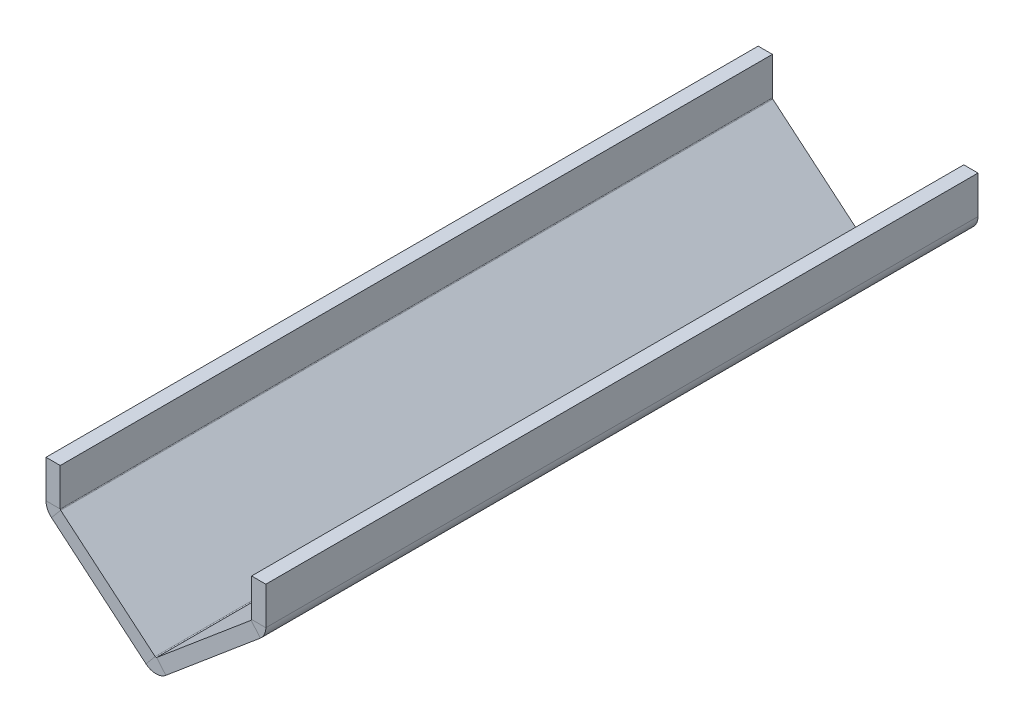
ISO-10303-21;
HEADER;
FILE_DESCRIPTION(('STEP AP214'),'2;1');
FILE_NAME('part.step','',(''),(''),'','','');
FILE_SCHEMA(('AUTOMOTIVE_DESIGN { 1 0 10303 214 1 1 1 1 }'));
ENDSEC;
DATA;
#1=APPLICATION_CONTEXT('core data for automotive mechanical design processes');
#2=APPLICATION_PROTOCOL_DEFINITION('international standard','automotive_design',2000,#1);
#3=PRODUCT_CONTEXT('',#1,'mechanical');
#4=PRODUCT('Part','Part','',(#3));
#5=PRODUCT_RELATED_PRODUCT_CATEGORY('part','',(#4));
#6=PRODUCT_DEFINITION_FORMATION('','',#4);
#7=PRODUCT_DEFINITION_CONTEXT('part definition',#1,'design');
#8=PRODUCT_DEFINITION('design','',#6,#7);
#9=PRODUCT_DEFINITION_SHAPE('','',#8);
#10=(LENGTH_UNIT() NAMED_UNIT(*) SI_UNIT(.MILLI.,.METRE.));
#11=(NAMED_UNIT(*) PLANE_ANGLE_UNIT() SI_UNIT($,.RADIAN.));
#12=(NAMED_UNIT(*) SI_UNIT($,.STERADIAN.) SOLID_ANGLE_UNIT());
#13=UNCERTAINTY_MEASURE_WITH_UNIT(LENGTH_MEASURE(1.E-05),#10,'distance_accuracy_value','');
#14=(GEOMETRIC_REPRESENTATION_CONTEXT(3) GLOBAL_UNCERTAINTY_ASSIGNED_CONTEXT((#13)) GLOBAL_UNIT_ASSIGNED_CONTEXT((#10,
#11,#12)) REPRESENTATION_CONTEXT('',''));
#15=CARTESIAN_POINT('',(0.,0.,0.));
#16=DIRECTION('',(0.,0.,1.));
#17=DIRECTION('',(1.,0.,0.));
#18=AXIS2_PLACEMENT_3D('',#15,#16,#17);
#19=CARTESIAN_POINT('',(-46.3039940096803,41.9601722653271,300.));
#20=DIRECTION('',(0.,0.,1.));
#21=DIRECTION('',(1.,0.,0.));
#22=AXIS2_PLACEMENT_3D('',#19,#20,#21);
#23=PLANE('',#22);
#24=DIRECTION('',(1.,0.,0.));
#25=VECTOR('',#24,1.);
#26=CARTESIAN_POINT('',(-46.3039940096803,41.9601722653271,300.));
#27=LINE('',#26,#25);
#28=CARTESIAN_POINT('',(-46.3039940096803,41.9601722653271,300.));
#29=VERTEX_POINT('',#28);
#30=CARTESIAN_POINT('',(-40.3039940096803,41.9601722653271,300.));
#31=VERTEX_POINT('',#30);
#32=EDGE_CURVE('E11',#29,#31,#27,.T.);
#33=ORIENTED_EDGE('',*,*,#32,.F.);
#34=CARTESIAN_POINT('',(-39.8039940096803,41.9601722653271,300.));
#35=DIRECTION('',(0.,0.,-1.));
#36=DIRECTION('',(-1.,0.,0.));
#37=AXIS2_PLACEMENT_3D('',#34,#35,#36);
#38=CIRCLE('',#37,6.5);
#39=CARTESIAN_POINT('',(-43.9871232436003,36.9850913803239,300.));
#40=VERTEX_POINT('',#39);
#41=EDGE_CURVE('E304',#40,#29,#38,.T.);
#42=ORIENTED_EDGE('',*,*,#41,.F.);
#43=DIRECTION('',(-0.643558343679996,-0.76539705923126,0.));
#44=VECTOR('',#43,1.);
#45=CARTESIAN_POINT('',(-40.1257731815203,41.5774737357114,300.));
#46=LINE('',#45,#44);
#47=CARTESIAN_POINT('',(-40.1257731815203,41.5774737357114,300.));
#48=VERTEX_POINT('',#47);
#49=EDGE_CURVE('E51',#48,#40,#46,.T.);
#50=ORIENTED_EDGE('',*,*,#49,.F.);
#51=CARTESIAN_POINT('',(-39.8039940096803,41.9601722653271,300.));
#52=DIRECTION('',(0.,0.,1.));
#53=DIRECTION('',(1.,0.,0.));
#54=AXIS2_PLACEMENT_3D('',#51,#52,#53);
#55=CIRCLE('',#54,0.5);
#56=EDGE_CURVE('E199',#48,#31,#55,.F.);
#57=ORIENTED_EDGE('',*,*,#56,.T.);
#58=EDGE_LOOP('',(#33,#42,#50,#57));
#59=FACE_BOUND('',#58,.T.);
#60=ADVANCED_FACE('F43',(#59),#23,.T.);
#61=CARTESIAN_POINT('',(-40.1257731815203,41.5774737357114,300.));
#62=DIRECTION('',(0.,0.,1.));
#63=DIRECTION('',(1.,0.,0.));
#64=AXIS2_PLACEMENT_3D('',#61,#62,#63);
#65=PLANE('',#64);
#66=DIRECTION('',(0.,1.,0.));
#67=VECTOR('',#66,1.);
#68=CARTESIAN_POINT('',(-46.3039940096803,38.933154146905,300.));
#69=LINE('',#68,#67);
#70=CARTESIAN_POINT('',(-46.3039940096803,57.8327435386112,300.));
#71=VERTEX_POINT('',#70);
#72=EDGE_CURVE('E308',#29,#71,#69,.T.);
#73=ORIENTED_EDGE('',*,*,#72,.F.);
#74=ORIENTED_EDGE('',*,*,#32,.T.);
#75=DIRECTION('',(0.,1.,0.));
#76=VECTOR('',#75,1.);
#77=CARTESIAN_POINT('',(-40.3039940096803,38.933154146905,300.));
#78=LINE('',#77,#76);
#79=CARTESIAN_POINT('',(-40.3039940096803,57.8327435386112,300.));
#80=VERTEX_POINT('',#79);
#81=EDGE_CURVE('E123',#31,#80,#78,.T.);
#82=ORIENTED_EDGE('',*,*,#81,.T.);
#83=DIRECTION('',(1.,0.,0.));
#84=VECTOR('',#83,1.);
#85=CARTESIAN_POINT('',(-46.3039940096803,57.8327435386112,300.));
#86=LINE('',#85,#84);
#87=EDGE_CURVE('E699',#71,#80,#86,.T.);
#88=ORIENTED_EDGE('',*,*,#87,.F.);
#89=EDGE_LOOP('',(#73,#74,#82,#88));
#90=FACE_BOUND('',#89,.T.);
#91=ADVANCED_FACE('F397',(#90),#65,.T.);
#92=CARTESIAN_POINT('',(-43.9871232436003,36.9850913803239,0.));
#93=DIRECTION('',(0.,0.,-1.));
#94=DIRECTION('',(-1.,0.,0.));
#95=AXIS2_PLACEMENT_3D('',#92,#93,#94);
#96=PLANE('',#95);
#97=DIRECTION('',(0.643558343679996,0.76539705923126,0.));
#98=VECTOR('',#97,1.);
#99=CARTESIAN_POINT('',(-43.9871232436003,36.9850913803239,0.));
#100=LINE('',#99,#98);
#101=CARTESIAN_POINT('',(-43.9871232436003,36.9850913803239,0.));
#102=VERTEX_POINT('',#101);
#103=CARTESIAN_POINT('',(-40.1257731815203,41.5774737357114,0.));
#104=VERTEX_POINT('',#103);
#105=EDGE_CURVE('E110',#102,#104,#100,.T.);
#106=ORIENTED_EDGE('',*,*,#105,.F.);
#107=CARTESIAN_POINT('',(-39.8039940096803,41.9601722653271,0.));
#108=DIRECTION('',(0.,0.,-1.));
#109=DIRECTION('',(-1.,0.,0.));
#110=AXIS2_PLACEMENT_3D('',#107,#108,#109);
#111=CIRCLE('',#110,6.5);
#112=CARTESIAN_POINT('',(-46.3039940096803,41.9601722653271,0.));
#113=VERTEX_POINT('',#112);
#114=EDGE_CURVE('E214',#102,#113,#111,.T.);
#115=ORIENTED_EDGE('',*,*,#114,.T.);
#116=DIRECTION('',(-1.,0.,0.));
#117=VECTOR('',#116,1.);
#118=CARTESIAN_POINT('',(-40.3039940096803,41.9601722653271,0.));
#119=LINE('',#118,#117);
#120=CARTESIAN_POINT('',(-40.3039940096803,41.9601722653271,0.));
#121=VERTEX_POINT('',#120);
#122=EDGE_CURVE('E117',#121,#113,#119,.T.);
#123=ORIENTED_EDGE('',*,*,#122,.F.);
#124=CARTESIAN_POINT('',(-39.8039940096803,41.9601722653271,0.));
#125=DIRECTION('',(0.,0.,1.));
#126=DIRECTION('',(1.,0.,0.));
#127=AXIS2_PLACEMENT_3D('',#124,#125,#126);
#128=CIRCLE('',#127,0.5);
#129=EDGE_CURVE('E245',#104,#121,#128,.F.);
#130=ORIENTED_EDGE('',*,*,#129,.F.);
#131=EDGE_LOOP('',(#106,#115,#123,#130));
#132=FACE_BOUND('',#131,.T.);
#133=ADVANCED_FACE('F401',(#132),#96,.T.);
#134=CARTESIAN_POINT('',(-40.3039940096803,41.9601722653271,0.));
#135=DIRECTION('',(0.,0.,-1.));
#136=DIRECTION('',(-1.,0.,0.));
#137=AXIS2_PLACEMENT_3D('',#134,#135,#136);
#138=PLANE('',#137);
#139=DIRECTION('',(-0.765397059231259,0.643558343679997,0.));
#140=VECTOR('',#139,1.);
#141=CARTESIAN_POINT('',(0.,0.,0.));
#142=LINE('',#141,#140);
#143=CARTESIAN_POINT('',(-4.18312923391998,3.51724335586652,0.));
#144=VERTEX_POINT('',#143);
#145=EDGE_CURVE('E216',#144,#102,#142,.T.);
#146=ORIENTED_EDGE('',*,*,#145,.T.);
#147=ORIENTED_EDGE('',*,*,#105,.T.);
#148=DIRECTION('',(-0.765397059231259,0.643558343679997,0.));
#149=VECTOR('',#148,1.);
#150=CARTESIAN_POINT('',(3.86135006207998,4.59238235538755,0.));
#151=LINE('',#150,#149);
#152=CARTESIAN_POINT('',(-0.321779171840001,8.10962571125407,0.));
#153=VERTEX_POINT('',#152);
#154=EDGE_CURVE('E243',#153,#104,#151,.T.);
#155=ORIENTED_EDGE('',*,*,#154,.F.);
#156=DIRECTION('',(-0.643558343679996,-0.765397059231259,0.));
#157=VECTOR('',#156,1.);
#158=CARTESIAN_POINT('',(-0.321779171840001,8.10962571125407,0.));
#159=LINE('',#158,#157);
#160=EDGE_CURVE('E291',#153,#144,#159,.T.);
#161=ORIENTED_EDGE('',*,*,#160,.T.);
#162=EDGE_LOOP('',(#146,#147,#155,#161));
#163=FACE_BOUND('',#162,.T.);
#164=ADVANCED_FACE('F345',(#163),#138,.T.);
#165=CARTESIAN_POINT('',(-4.18312923391998,3.51724335586652,300.));
#166=DIRECTION('',(0.,0.,1.));
#167=DIRECTION('',(1.,0.,0.));
#168=AXIS2_PLACEMENT_3D('',#165,#166,#167);
#169=PLANE('',#168);
#170=DIRECTION('',(0.643558343679996,0.765397059231259,0.));
#171=VECTOR('',#170,1.);
#172=CARTESIAN_POINT('',(-4.18312923391998,3.51724335586652,300.));
#173=LINE('',#172,#171);
#174=CARTESIAN_POINT('',(-4.18312923391998,3.51724335586652,300.));
#175=VERTEX_POINT('',#174);
#176=CARTESIAN_POINT('',(-0.321779171840001,8.10962571125407,300.));
#177=VERTEX_POINT('',#176);
#178=EDGE_CURVE('E163',#175,#177,#173,.T.);
#179=ORIENTED_EDGE('',*,*,#178,.F.);
#180=CARTESIAN_POINT('',(0.,8.4923242408697,300.));
#181=DIRECTION('',(0.,0.,-1.));
#182=DIRECTION('',(-1.,0.,0.));
#183=AXIS2_PLACEMENT_3D('',#180,#181,#182);
#184=CIRCLE('',#183,6.5);
#185=CARTESIAN_POINT('',(4.18312923391998,3.51724335586652,300.));
#186=VERTEX_POINT('',#185);
#187=EDGE_CURVE('E311',#186,#175,#184,.T.);
#188=ORIENTED_EDGE('',*,*,#187,.F.);
#189=DIRECTION('',(0.643558343679997,-0.765397059231259,0.));
#190=VECTOR('',#189,1.);
#191=CARTESIAN_POINT('',(0.321779171839999,8.10962571125407,300.));
#192=LINE('',#191,#190);
#193=CARTESIAN_POINT('',(0.321779171839999,8.10962571125407,300.));
#194=VERTEX_POINT('',#193);
#195=EDGE_CURVE('E175',#194,#186,#192,.T.);
#196=ORIENTED_EDGE('',*,*,#195,.F.);
#197=CARTESIAN_POINT('',(0.,8.4923242408697,300.));
#198=DIRECTION('',(0.,0.,1.));
#199=DIRECTION('',(1.,0.,0.));
#200=AXIS2_PLACEMENT_3D('',#197,#198,#199);
#201=CIRCLE('',#200,0.5);
#202=EDGE_CURVE('E178',#194,#177,#201,.F.);
#203=ORIENTED_EDGE('',*,*,#202,.T.);
#204=EDGE_LOOP('',(#179,#188,#196,#203));
#205=FACE_BOUND('',#204,.T.);
#206=ADVANCED_FACE('F180',(#205),#169,.T.);
#207=CARTESIAN_POINT('',(0.321779171839999,8.10962571125407,300.));
#208=DIRECTION('',(0.,0.,1.));
#209=DIRECTION('',(1.,0.,0.));
#210=AXIS2_PLACEMENT_3D('',#207,#208,#209);
#211=PLANE('',#210);
#212=DIRECTION('',(-0.765397059231259,0.643558343679997,0.));
#213=VECTOR('',#212,1.);
#214=CARTESIAN_POINT('',(0.,0.,300.));
#215=LINE('',#214,#213);
#216=EDGE_CURVE('E170',#175,#40,#215,.T.);
#217=ORIENTED_EDGE('',*,*,#216,.F.);
#218=ORIENTED_EDGE('',*,*,#178,.T.);
#219=DIRECTION('',(-0.765397059231259,0.643558343679997,0.));
#220=VECTOR('',#219,1.);
#221=CARTESIAN_POINT('',(3.86135006207998,4.59238235538755,300.));
#222=LINE('',#221,#220);
#223=EDGE_CURVE('E167',#177,#48,#222,.T.);
#224=ORIENTED_EDGE('',*,*,#223,.T.);
#225=ORIENTED_EDGE('',*,*,#49,.T.);
#226=EDGE_LOOP('',(#217,#218,#224,#225));
#227=FACE_BOUND('',#226,.T.);
#228=ADVANCED_FACE('F165',(#227),#211,.T.);
#229=CARTESIAN_POINT('',(4.18312923391998,3.51724335586652,0.));
#230=DIRECTION('',(0.,0.,-1.));
#231=DIRECTION('',(-1.,0.,0.));
#232=AXIS2_PLACEMENT_3D('',#229,#230,#231);
#233=PLANE('',#232);
#234=DIRECTION('',(-0.643558343679997,0.765397059231259,0.));
#235=VECTOR('',#234,1.);
#236=CARTESIAN_POINT('',(4.18312923391998,3.51724335586652,0.));
#237=LINE('',#236,#235);
#238=CARTESIAN_POINT('',(4.18312923391998,3.51724335586652,0.));
#239=VERTEX_POINT('',#238);
#240=CARTESIAN_POINT('',(0.321779171839999,8.10962571125407,0.));
#241=VERTEX_POINT('',#240);
#242=EDGE_CURVE('E293',#239,#241,#237,.T.);
#243=ORIENTED_EDGE('',*,*,#242,.F.);
#244=CARTESIAN_POINT('',(0.,8.4923242408697,0.));
#245=DIRECTION('',(0.,0.,-1.));
#246=DIRECTION('',(-1.,0.,0.));
#247=AXIS2_PLACEMENT_3D('',#244,#245,#246);
#248=CIRCLE('',#247,6.5);
#249=EDGE_CURVE('E218',#239,#144,#248,.T.);
#250=ORIENTED_EDGE('',*,*,#249,.T.);
#251=ORIENTED_EDGE('',*,*,#160,.F.);
#252=CARTESIAN_POINT('',(0.,8.4923242408697,0.));
#253=DIRECTION('',(0.,0.,1.));
#254=DIRECTION('',(1.,0.,0.));
#255=AXIS2_PLACEMENT_3D('',#252,#253,#254);
#256=CIRCLE('',#255,0.5);
#257=EDGE_CURVE('E191',#241,#153,#256,.F.);
#258=ORIENTED_EDGE('',*,*,#257,.F.);
#259=EDGE_LOOP('',(#243,#250,#251,#258));
#260=FACE_BOUND('',#259,.T.);
#261=ADVANCED_FACE('F343',(#260),#233,.T.);
#262=CARTESIAN_POINT('',(-0.321779171840001,8.10962571125407,0.));
#263=DIRECTION('',(0.,0.,-1.));
#264=DIRECTION('',(-1.,0.,0.));
#265=AXIS2_PLACEMENT_3D('',#262,#263,#264);
#266=PLANE('',#265);
#267=DIRECTION('',(-0.765397059231259,-0.643558343679997,0.));
#268=VECTOR('',#267,1.);
#269=CARTESIAN_POINT('',(0.,0.,0.));
#270=LINE('',#269,#268);
#271=CARTESIAN_POINT('',(43.9871232436003,36.9850913803239,0.));
#272=VERTEX_POINT('',#271);
#273=EDGE_CURVE('E221',#272,#239,#270,.T.);
#274=ORIENTED_EDGE('',*,*,#273,.T.);
#275=ORIENTED_EDGE('',*,*,#242,.T.);
#276=DIRECTION('',(-0.765397059231259,-0.643558343679997,0.));
#277=VECTOR('',#276,1.);
#278=CARTESIAN_POINT('',(-3.86135006207998,4.59238235538755,0.));
#279=LINE('',#278,#277);
#280=CARTESIAN_POINT('',(40.1257731815203,41.5774737357115,0.));
#281=VERTEX_POINT('',#280);
#282=EDGE_CURVE('E239',#281,#241,#279,.T.);
#283=ORIENTED_EDGE('',*,*,#282,.F.);
#284=DIRECTION('',(0.643558343679994,-0.765397059231261,0.));
#285=VECTOR('',#284,1.);
#286=CARTESIAN_POINT('',(40.1257731815203,41.5774737357115,0.));
#287=LINE('',#286,#285);
#288=EDGE_CURVE('E283',#281,#272,#287,.T.);
#289=ORIENTED_EDGE('',*,*,#288,.T.);
#290=EDGE_LOOP('',(#274,#275,#283,#289));
#291=FACE_BOUND('',#290,.T.);
#292=ADVANCED_FACE('F380',(#291),#266,.T.);
#293=CARTESIAN_POINT('',(43.9871232436003,36.9850913803239,300.));
#294=DIRECTION('',(0.,0.,1.));
#295=DIRECTION('',(1.,0.,0.));
#296=AXIS2_PLACEMENT_3D('',#293,#294,#295);
#297=PLANE('',#296);
#298=DIRECTION('',(-0.643558343679994,0.765397059231261,0.));
#299=VECTOR('',#298,1.);
#300=CARTESIAN_POINT('',(43.9871232436003,36.9850913803239,300.));
#301=LINE('',#300,#299);
#302=CARTESIAN_POINT('',(43.9871232436003,36.9850913803239,300.));
#303=VERTEX_POINT('',#302);
#304=CARTESIAN_POINT('',(40.1257731815203,41.5774737357115,300.));
#305=VERTEX_POINT('',#304);
#306=EDGE_CURVE('E289',#303,#305,#301,.T.);
#307=ORIENTED_EDGE('',*,*,#306,.F.);
#308=CARTESIAN_POINT('',(39.8039940096803,41.9601722653271,300.));
#309=DIRECTION('',(0.,0.,-1.));
#310=DIRECTION('',(-1.,0.,0.));
#311=AXIS2_PLACEMENT_3D('',#308,#309,#310);
#312=CIRCLE('',#311,6.5);
#313=CARTESIAN_POINT('',(46.3039940096803,41.9601722653271,300.));
#314=VERTEX_POINT('',#313);
#315=EDGE_CURVE('E319',#314,#303,#312,.T.);
#316=ORIENTED_EDGE('',*,*,#315,.F.);
#317=DIRECTION('',(1.,0.,0.));
#318=VECTOR('',#317,1.);
#319=CARTESIAN_POINT('',(40.3039940096803,41.9601722653271,300.));
#320=LINE('',#319,#318);
#321=CARTESIAN_POINT('',(40.3039940096803,41.9601722653271,300.));
#322=VERTEX_POINT('',#321);
#323=EDGE_CURVE('E287',#322,#314,#320,.T.);
#324=ORIENTED_EDGE('',*,*,#323,.F.);
#325=CARTESIAN_POINT('',(39.8039940096803,41.9601722653271,300.));
#326=DIRECTION('',(0.,0.,1.));
#327=DIRECTION('',(1.,0.,0.));
#328=AXIS2_PLACEMENT_3D('',#325,#326,#327);
#329=CIRCLE('',#328,0.5);
#330=EDGE_CURVE('E331',#322,#305,#329,.F.);
#331=ORIENTED_EDGE('',*,*,#330,.T.);
#332=EDGE_LOOP('',(#307,#316,#324,#331));
#333=FACE_BOUND('',#332,.T.);
#334=ADVANCED_FACE('F358',(#333),#297,.T.);
#335=CARTESIAN_POINT('',(40.3039940096803,41.9601722653271,300.));
#336=DIRECTION('',(0.,0.,1.));
#337=DIRECTION('',(1.,0.,0.));
#338=AXIS2_PLACEMENT_3D('',#335,#336,#337);
#339=PLANE('',#338);
#340=DIRECTION('',(-0.765397059231259,-0.643558343679997,0.));
#341=VECTOR('',#340,1.);
#342=CARTESIAN_POINT('',(0.,0.,300.));
#343=LINE('',#342,#341);
#344=EDGE_CURVE('E313',#303,#186,#343,.T.);
#345=ORIENTED_EDGE('',*,*,#344,.F.);
#346=ORIENTED_EDGE('',*,*,#306,.T.);
#347=DIRECTION('',(-0.765397059231259,-0.643558343679997,0.));
#348=VECTOR('',#347,1.);
#349=CARTESIAN_POINT('',(-3.86135006207998,4.59238235538755,300.));
#350=LINE('',#349,#348);
#351=EDGE_CURVE('E184',#305,#194,#350,.T.);
#352=ORIENTED_EDGE('',*,*,#351,.T.);
#353=ORIENTED_EDGE('',*,*,#195,.T.);
#354=EDGE_LOOP('',(#345,#346,#352,#353));
#355=FACE_BOUND('',#354,.T.);
#356=ADVANCED_FACE('F337',(#355),#339,.T.);
#357=CARTESIAN_POINT('',(46.3039940096803,41.9601722653271,0.));
#358=DIRECTION('',(0.,0.,-1.));
#359=DIRECTION('',(-1.,0.,0.));
#360=AXIS2_PLACEMENT_3D('',#357,#358,#359);
#361=PLANE('',#360);
#362=DIRECTION('',(-1.,0.,0.));
#363=VECTOR('',#362,1.);
#364=CARTESIAN_POINT('',(46.3039940096803,41.9601722653271,0.));
#365=LINE('',#364,#363);
#366=CARTESIAN_POINT('',(46.3039940096803,41.9601722653271,0.));
#367=VERTEX_POINT('',#366);
#368=CARTESIAN_POINT('',(40.3039940096803,41.9601722653271,0.));
#369=VERTEX_POINT('',#368);
#370=EDGE_CURVE('E285',#367,#369,#365,.T.);
#371=ORIENTED_EDGE('',*,*,#370,.F.);
#372=CARTESIAN_POINT('',(39.8039940096803,41.9601722653271,0.));
#373=DIRECTION('',(0.,0.,-1.));
#374=DIRECTION('',(-1.,0.,0.));
#375=AXIS2_PLACEMENT_3D('',#372,#373,#374);
#376=CIRCLE('',#375,6.5);
#377=EDGE_CURVE('E224',#367,#272,#376,.T.);
#378=ORIENTED_EDGE('',*,*,#377,.T.);
#379=ORIENTED_EDGE('',*,*,#288,.F.);
#380=CARTESIAN_POINT('',(39.8039940096803,41.9601722653271,0.));
#381=DIRECTION('',(0.,0.,1.));
#382=DIRECTION('',(1.,0.,0.));
#383=AXIS2_PLACEMENT_3D('',#380,#381,#382);
#384=CIRCLE('',#383,0.5);
#385=EDGE_CURVE('E236',#369,#281,#384,.F.);
#386=ORIENTED_EDGE('',*,*,#385,.F.);
#387=EDGE_LOOP('',(#371,#378,#379,#386));
#388=FACE_BOUND('',#387,.T.);
#389=ADVANCED_FACE('F382',(#388),#361,.T.);
#390=CARTESIAN_POINT('',(40.1257731815203,41.5774737357115,0.));
#391=DIRECTION('',(0.,0.,-1.));
#392=DIRECTION('',(-1.,0.,0.));
#393=AXIS2_PLACEMENT_3D('',#390,#391,#392);
#394=PLANE('',#393);
#395=DIRECTION('',(0.,-1.,0.));
#396=VECTOR('',#395,1.);
#397=CARTESIAN_POINT('',(46.3039940096803,38.933154146905,0.));
#398=LINE('',#397,#396);
#399=CARTESIAN_POINT('',(46.3039940096803,57.8327435386112,0.));
#400=VERTEX_POINT('',#399);
#401=EDGE_CURVE('E227',#400,#367,#398,.T.);
#402=ORIENTED_EDGE('',*,*,#401,.T.);
#403=ORIENTED_EDGE('',*,*,#370,.T.);
#404=DIRECTION('',(0.,1.,0.));
#405=VECTOR('',#404,1.);
#406=CARTESIAN_POINT('',(40.3039940096803,38.933154146905,0.));
#407=LINE('',#406,#405);
#408=CARTESIAN_POINT('',(40.3039940096803,57.8327435386112,0.));
#409=VERTEX_POINT('',#408);
#410=EDGE_CURVE('E233',#409,#369,#407,.F.);
#411=ORIENTED_EDGE('',*,*,#410,.F.);
#412=DIRECTION('',(1.,0.,0.));
#413=VECTOR('',#412,1.);
#414=CARTESIAN_POINT('',(40.3039940096803,57.8327435386112,0.));
#415=LINE('',#414,#413);
#416=EDGE_CURVE('E230',#409,#400,#415,.T.);
#417=ORIENTED_EDGE('',*,*,#416,.T.);
#418=EDGE_LOOP('',(#402,#403,#411,#417));
#419=FACE_BOUND('',#418,.T.);
#420=ADVANCED_FACE('F384',(#419),#394,.T.);
#421=CARTESIAN_POINT('',(-40.3039940096803,38.933154146905,300.));
#422=DIRECTION('',(-1.,0.,0.));
#423=DIRECTION('',(0.,0.,1.));
#424=AXIS2_PLACEMENT_3D('',#421,#422,#423);
#425=PLANE('',#424);
#426=DIRECTION('',(0.,1.,0.));
#427=VECTOR('',#426,1.);
#428=CARTESIAN_POINT('',(-40.3039940096803,38.933154146905,0.));
#429=LINE('',#428,#427);
#430=CARTESIAN_POINT('',(-40.3039940096803,57.8327435386112,0.));
#431=VERTEX_POINT('',#430);
#432=EDGE_CURVE('E205',#121,#431,#429,.T.);
#433=ORIENTED_EDGE('',*,*,#432,.T.);
#434=DIRECTION('',(0.,0.,-1.));
#435=VECTOR('',#434,1.);
#436=CARTESIAN_POINT('',(-40.3039940096803,57.8327435386112,300.));
#437=LINE('',#436,#435);
#438=EDGE_CURVE('E281',#80,#431,#437,.T.);
#439=ORIENTED_EDGE('',*,*,#438,.F.);
#440=ORIENTED_EDGE('',*,*,#81,.F.);
#441=DIRECTION('',(0.,0.,-1.));
#442=VECTOR('',#441,1.);
#443=CARTESIAN_POINT('',(-40.3039940096803,41.9601722653271,300.));
#444=LINE('',#443,#442);
#445=EDGE_CURVE('E201',#31,#121,#444,.T.);
#446=ORIENTED_EDGE('',*,*,#445,.T.);
#447=EDGE_LOOP('',(#433,#439,#440,#446));
#448=FACE_BOUND('',#447,.T.);
#449=ADVANCED_FACE('F386',(#448),#425,.F.);
#450=CARTESIAN_POINT('',(-46.3039940096803,57.8327435386112,300.));
#451=DIRECTION('',(0.,1.,0.));
#452=DIRECTION('',(0.,0.,1.));
#453=AXIS2_PLACEMENT_3D('',#450,#451,#452);
#454=PLANE('',#453);
#455=DIRECTION('',(1.,0.,0.));
#456=VECTOR('',#455,1.);
#457=CARTESIAN_POINT('',(-46.3039940096803,57.8327435386112,0.));
#458=LINE('',#457,#456);
#459=CARTESIAN_POINT('',(-46.3039940096803,57.8327435386112,0.));
#460=VERTEX_POINT('',#459);
#461=EDGE_CURVE('E208',#460,#431,#458,.T.);
#462=ORIENTED_EDGE('',*,*,#461,.F.);
#463=DIRECTION('',(0.,0.,-1.));
#464=VECTOR('',#463,1.);
#465=CARTESIAN_POINT('',(-46.3039940096803,57.8327435386112,300.));
#466=LINE('',#465,#464);
#467=EDGE_CURVE('E279',#71,#460,#466,.T.);
#468=ORIENTED_EDGE('',*,*,#467,.F.);
#469=ORIENTED_EDGE('',*,*,#87,.T.);
#470=ORIENTED_EDGE('',*,*,#438,.T.);
#471=EDGE_LOOP('',(#462,#468,#469,#470));
#472=FACE_BOUND('',#471,.T.);
#473=ADVANCED_FACE('F392',(#472),#454,.T.);
#474=CARTESIAN_POINT('',(-46.3039940096803,38.933154146905,300.));
#475=DIRECTION('',(-1.,0.,0.));
#476=DIRECTION('',(0.,0.,1.));
#477=AXIS2_PLACEMENT_3D('',#474,#475,#476);
#478=PLANE('',#477);
#479=DIRECTION('',(0.,1.,0.));
#480=VECTOR('',#479,1.);
#481=CARTESIAN_POINT('',(-46.3039940096803,38.933154146905,0.));
#482=LINE('',#481,#480);
#483=EDGE_CURVE('E211',#113,#460,#482,.T.);
#484=ORIENTED_EDGE('',*,*,#483,.F.);
#485=DIRECTION('',(0.,0.,-1.));
#486=VECTOR('',#485,1.);
#487=CARTESIAN_POINT('',(-46.3039940096803,41.9601722653271,300.));
#488=LINE('',#487,#486);
#489=EDGE_CURVE('E276',#29,#113,#488,.T.);
#490=ORIENTED_EDGE('',*,*,#489,.F.);
#491=ORIENTED_EDGE('',*,*,#72,.T.);
#492=ORIENTED_EDGE('',*,*,#467,.T.);
#493=EDGE_LOOP('',(#484,#490,#491,#492));
#494=FACE_BOUND('',#493,.T.);
#495=ADVANCED_FACE('F452',(#494),#478,.T.);
#496=CARTESIAN_POINT('',(-39.8039940096803,41.9601722653271,300.));
#497=DIRECTION('',(0.,0.,-1.));
#498=DIRECTION('',(-1.,0.,0.));
#499=AXIS2_PLACEMENT_3D('',#496,#497,#498);
#500=CYLINDRICAL_SURFACE('',#499,6.5);
#501=ORIENTED_EDGE('',*,*,#114,.F.);
#502=DIRECTION('',(0.,0.,-1.));
#503=VECTOR('',#502,1.);
#504=CARTESIAN_POINT('',(-43.9871232436003,36.9850913803239,300.));
#505=LINE('',#504,#503);
#506=EDGE_CURVE('E273',#40,#102,#505,.T.);
#507=ORIENTED_EDGE('',*,*,#506,.F.);
#508=ORIENTED_EDGE('',*,*,#41,.T.);
#509=ORIENTED_EDGE('',*,*,#489,.T.);
#510=EDGE_LOOP('',(#501,#507,#508,#509));
#511=FACE_BOUND('',#510,.T.);
#512=ADVANCED_FACE('F303',(#511),#500,.T.);
#513=CARTESIAN_POINT('',(0.,0.,300.));
#514=DIRECTION('',(-0.643558343679997,-0.765397059231259,0.));
#515=DIRECTION('',(0.765397059231259,-0.643558343679997,0.));
#516=AXIS2_PLACEMENT_3D('',#513,#514,#515);
#517=PLANE('',#516);
#518=ORIENTED_EDGE('',*,*,#145,.F.);
#519=DIRECTION('',(0.,0.,-1.));
#520=VECTOR('',#519,1.);
#521=CARTESIAN_POINT('',(-4.18312923391998,3.51724335586652,300.));
#522=LINE('',#521,#520);
#523=EDGE_CURVE('E270',#175,#144,#522,.T.);
#524=ORIENTED_EDGE('',*,*,#523,.F.);
#525=ORIENTED_EDGE('',*,*,#216,.T.);
#526=ORIENTED_EDGE('',*,*,#506,.T.);
#527=EDGE_LOOP('',(#518,#524,#525,#526));
#528=FACE_BOUND('',#527,.T.);
#529=ADVANCED_FACE('F310',(#528),#517,.T.);
#530=CARTESIAN_POINT('',(0.,8.4923242408697,300.));
#531=DIRECTION('',(0.,0.,-1.));
#532=DIRECTION('',(-1.,0.,0.));
#533=AXIS2_PLACEMENT_3D('',#530,#531,#532);
#534=CYLINDRICAL_SURFACE('',#533,6.5);
#535=ORIENTED_EDGE('',*,*,#249,.F.);
#536=DIRECTION('',(0.,0.,-1.));
#537=VECTOR('',#536,1.);
#538=CARTESIAN_POINT('',(4.18312923391998,3.51724335586652,300.));
#539=LINE('',#538,#537);
#540=EDGE_CURVE('E267',#186,#239,#539,.T.);
#541=ORIENTED_EDGE('',*,*,#540,.F.);
#542=ORIENTED_EDGE('',*,*,#187,.T.);
#543=ORIENTED_EDGE('',*,*,#523,.T.);
#544=EDGE_LOOP('',(#535,#541,#542,#543));
#545=FACE_BOUND('',#544,.T.);
#546=ADVANCED_FACE('F347',(#545),#534,.T.);
#547=CARTESIAN_POINT('',(0.,0.,300.));
#548=DIRECTION('',(0.643558343679997,-0.765397059231259,0.));
#549=DIRECTION('',(0.765397059231259,0.643558343679997,0.));
#550=AXIS2_PLACEMENT_3D('',#547,#548,#549);
#551=PLANE('',#550);
#552=ORIENTED_EDGE('',*,*,#273,.F.);
#553=DIRECTION('',(0.,0.,-1.));
#554=VECTOR('',#553,1.);
#555=CARTESIAN_POINT('',(43.9871232436003,36.9850913803239,300.));
#556=LINE('',#555,#554);
#557=EDGE_CURVE('E264',#303,#272,#556,.T.);
#558=ORIENTED_EDGE('',*,*,#557,.F.);
#559=ORIENTED_EDGE('',*,*,#344,.T.);
#560=ORIENTED_EDGE('',*,*,#540,.T.);
#561=EDGE_LOOP('',(#552,#558,#559,#560));
#562=FACE_BOUND('',#561,.T.);
#563=ADVANCED_FACE('F351',(#562),#551,.T.);
#564=CARTESIAN_POINT('',(39.8039940096803,41.9601722653271,300.));
#565=DIRECTION('',(0.,0.,-1.));
#566=DIRECTION('',(-1.,0.,0.));
#567=AXIS2_PLACEMENT_3D('',#564,#565,#566);
#568=CYLINDRICAL_SURFACE('',#567,6.5);
#569=ORIENTED_EDGE('',*,*,#377,.F.);
#570=DIRECTION('',(0.,0.,-1.));
#571=VECTOR('',#570,1.);
#572=CARTESIAN_POINT('',(46.3039940096803,41.9601722653271,300.));
#573=LINE('',#572,#571);
#574=EDGE_CURVE('E261',#314,#367,#573,.T.);
#575=ORIENTED_EDGE('',*,*,#574,.F.);
#576=ORIENTED_EDGE('',*,*,#315,.T.);
#577=ORIENTED_EDGE('',*,*,#557,.T.);
#578=EDGE_LOOP('',(#569,#575,#576,#577));
#579=FACE_BOUND('',#578,.T.);
#580=ADVANCED_FACE('F356',(#579),#568,.T.);
#581=CARTESIAN_POINT('',(46.3039940096803,38.933154146905,300.));
#582=DIRECTION('',(1.,0.,0.));
#583=DIRECTION('',(0.,0.,-1.));
#584=AXIS2_PLACEMENT_3D('',#581,#582,#583);
#585=PLANE('',#584);
#586=ORIENTED_EDGE('',*,*,#401,.F.);
#587=DIRECTION('',(0.,0.,-1.));
#588=VECTOR('',#587,1.);
#589=CARTESIAN_POINT('',(46.3039940096803,57.8327435386112,300.));
#590=LINE('',#589,#588);
#591=CARTESIAN_POINT('',(46.3039940096803,57.8327435386112,300.));
#592=VERTEX_POINT('',#591);
#593=EDGE_CURVE('E259',#592,#400,#590,.T.);
#594=ORIENTED_EDGE('',*,*,#593,.F.);
#595=DIRECTION('',(0.,-1.,0.));
#596=VECTOR('',#595,1.);
#597=CARTESIAN_POINT('',(46.3039940096803,38.933154146905,300.));
#598=LINE('',#597,#596);
#599=EDGE_CURVE('E322',#592,#314,#598,.T.);
#600=ORIENTED_EDGE('',*,*,#599,.T.);
#601=ORIENTED_EDGE('',*,*,#574,.T.);
#602=EDGE_LOOP('',(#586,#594,#600,#601));
#603=FACE_BOUND('',#602,.T.);
#604=ADVANCED_FACE('F362',(#603),#585,.T.);
#605=CARTESIAN_POINT('',(40.3039940096803,57.8327435386112,300.));
#606=DIRECTION('',(0.,1.,0.));
#607=DIRECTION('',(0.,0.,1.));
#608=AXIS2_PLACEMENT_3D('',#605,#606,#607);
#609=PLANE('',#608);
#610=ORIENTED_EDGE('',*,*,#416,.F.);
#611=DIRECTION('',(0.,0.,-1.));
#612=VECTOR('',#611,1.);
#613=CARTESIAN_POINT('',(40.3039940096803,57.8327435386112,300.));
#614=LINE('',#613,#612);
#615=CARTESIAN_POINT('',(40.3039940096803,57.8327435386112,300.));
#616=VERTEX_POINT('',#615);
#617=EDGE_CURVE('E257',#616,#409,#614,.T.);
#618=ORIENTED_EDGE('',*,*,#617,.F.);
#619=DIRECTION('',(1.,0.,0.));
#620=VECTOR('',#619,1.);
#621=CARTESIAN_POINT('',(40.3039940096803,57.8327435386112,300.));
#622=LINE('',#621,#620);
#623=EDGE_CURVE('E325',#616,#592,#622,.T.);
#624=ORIENTED_EDGE('',*,*,#623,.T.);
#625=ORIENTED_EDGE('',*,*,#593,.T.);
#626=EDGE_LOOP('',(#610,#618,#624,#625));
#627=FACE_BOUND('',#626,.T.);
#628=ADVANCED_FACE('F368',(#627),#609,.T.);
#629=CARTESIAN_POINT('',(40.3039940096803,38.933154146905,300.));
#630=DIRECTION('',(1.,0.,0.));
#631=DIRECTION('',(0.,0.,-1.));
#632=AXIS2_PLACEMENT_3D('',#629,#630,#631);
#633=PLANE('',#632);
#634=ORIENTED_EDGE('',*,*,#410,.T.);
#635=DIRECTION('',(0.,0.,-1.));
#636=VECTOR('',#635,1.);
#637=CARTESIAN_POINT('',(40.3039940096803,41.9601722653271,300.));
#638=LINE('',#637,#636);
#639=EDGE_CURVE('E254',#322,#369,#638,.T.);
#640=ORIENTED_EDGE('',*,*,#639,.F.);
#641=DIRECTION('',(0.,1.,0.));
#642=VECTOR('',#641,1.);
#643=CARTESIAN_POINT('',(40.3039940096803,38.933154146905,300.));
#644=LINE('',#643,#642);
#645=EDGE_CURVE('E328',#616,#322,#644,.F.);
#646=ORIENTED_EDGE('',*,*,#645,.F.);
#647=ORIENTED_EDGE('',*,*,#617,.T.);
#648=EDGE_LOOP('',(#634,#640,#646,#647));
#649=FACE_BOUND('',#648,.T.);
#650=ADVANCED_FACE('F373',(#649),#633,.F.);
#651=CARTESIAN_POINT('',(39.8039940096803,41.9601722653271,300.));
#652=DIRECTION('',(0.,0.,-1.));
#653=DIRECTION('',(-1.,0.,0.));
#654=AXIS2_PLACEMENT_3D('',#651,#652,#653);
#655=CYLINDRICAL_SURFACE('',#654,0.5);
#656=ORIENTED_EDGE('',*,*,#385,.T.);
#657=DIRECTION('',(0.,0.,-1.));
#658=VECTOR('',#657,1.);
#659=CARTESIAN_POINT('',(40.1257731815203,41.5774737357115,300.));
#660=LINE('',#659,#658);
#661=EDGE_CURVE('E251',#305,#281,#660,.T.);
#662=ORIENTED_EDGE('',*,*,#661,.F.);
#663=ORIENTED_EDGE('',*,*,#330,.F.);
#664=ORIENTED_EDGE('',*,*,#639,.T.);
#665=EDGE_LOOP('',(#656,#662,#663,#664));
#666=FACE_BOUND('',#665,.T.);
#667=ADVANCED_FACE('F378',(#666),#655,.F.);
#668=CARTESIAN_POINT('',(-3.86135006207998,4.59238235538755,300.));
#669=DIRECTION('',(0.643558343679997,-0.765397059231259,0.));
#670=DIRECTION('',(0.765397059231259,0.643558343679997,0.));
#671=AXIS2_PLACEMENT_3D('',#668,#669,#670);
#672=PLANE('',#671);
#673=ORIENTED_EDGE('',*,*,#282,.T.);
#674=DIRECTION('',(0.,0.,-1.));
#675=VECTOR('',#674,1.);
#676=CARTESIAN_POINT('',(0.321779171839999,8.10962571125407,300.));
#677=LINE('',#676,#675);
#678=EDGE_CURVE('E193',#194,#241,#677,.T.);
#679=ORIENTED_EDGE('',*,*,#678,.F.);
#680=ORIENTED_EDGE('',*,*,#351,.F.);
#681=ORIENTED_EDGE('',*,*,#661,.T.);
#682=EDGE_LOOP('',(#673,#679,#680,#681));
#683=FACE_BOUND('',#682,.T.);
#684=ADVANCED_FACE('F340',(#683),#672,.F.);
#685=CARTESIAN_POINT('',(0.,8.4923242408697,300.));
#686=DIRECTION('',(0.,0.,-1.));
#687=DIRECTION('',(-1.,0.,0.));
#688=AXIS2_PLACEMENT_3D('',#685,#686,#687);
#689=CYLINDRICAL_SURFACE('',#688,0.5);
#690=ORIENTED_EDGE('',*,*,#257,.T.);
#691=DIRECTION('',(0.,0.,-1.));
#692=VECTOR('',#691,1.);
#693=CARTESIAN_POINT('',(-0.321779171840001,8.10962571125407,300.));
#694=LINE('',#693,#692);
#695=EDGE_CURVE('E188',#177,#153,#694,.T.);
#696=ORIENTED_EDGE('',*,*,#695,.F.);
#697=ORIENTED_EDGE('',*,*,#202,.F.);
#698=ORIENTED_EDGE('',*,*,#678,.T.);
#699=EDGE_LOOP('',(#690,#696,#697,#698));
#700=FACE_BOUND('',#699,.T.);
#701=ADVANCED_FACE('F189',(#700),#689,.F.);
#702=CARTESIAN_POINT('',(3.86135006207998,4.59238235538755,300.));
#703=DIRECTION('',(-0.643558343679997,-0.765397059231259,0.));
#704=DIRECTION('',(0.765397059231259,-0.643558343679997,0.));
#705=AXIS2_PLACEMENT_3D('',#702,#703,#704);
#706=PLANE('',#705);
#707=ORIENTED_EDGE('',*,*,#154,.T.);
#708=DIRECTION('',(0.,0.,-1.));
#709=VECTOR('',#708,1.);
#710=CARTESIAN_POINT('',(-40.1257731815203,41.5774737357114,300.));
#711=LINE('',#710,#709);
#712=EDGE_CURVE('E194',#48,#104,#711,.T.);
#713=ORIENTED_EDGE('',*,*,#712,.F.);
#714=ORIENTED_EDGE('',*,*,#223,.F.);
#715=ORIENTED_EDGE('',*,*,#695,.T.);
#716=EDGE_LOOP('',(#707,#713,#714,#715));
#717=FACE_BOUND('',#716,.T.);
#718=ADVANCED_FACE('F196',(#717),#706,.F.);
#719=CARTESIAN_POINT('',(-39.8039940096803,41.9601722653271,300.));
#720=DIRECTION('',(0.,0.,-1.));
#721=DIRECTION('',(-1.,0.,0.));
#722=AXIS2_PLACEMENT_3D('',#719,#720,#721);
#723=CYLINDRICAL_SURFACE('',#722,0.5);
#724=ORIENTED_EDGE('',*,*,#129,.T.);
#725=ORIENTED_EDGE('',*,*,#445,.F.);
#726=ORIENTED_EDGE('',*,*,#56,.F.);
#727=ORIENTED_EDGE('',*,*,#712,.T.);
#728=EDGE_LOOP('',(#724,#725,#726,#727));
#729=FACE_BOUND('',#728,.T.);
#730=ADVANCED_FACE('F572',(#729),#723,.F.);
#731=CARTESIAN_POINT('',(-39.8039940096803,41.9601722653271,300.));
#732=DIRECTION('',(0.,0.,-1.));
#733=DIRECTION('',(-1.,0.,0.));
#734=AXIS2_PLACEMENT_3D('',#731,#732,#733);
#735=PLANE('',#734);
#736=ORIENTED_EDGE('',*,*,#645,.T.);
#737=ORIENTED_EDGE('',*,*,#323,.T.);
#738=ORIENTED_EDGE('',*,*,#599,.F.);
#739=ORIENTED_EDGE('',*,*,#623,.F.);
#740=EDGE_LOOP('',(#736,#737,#738,#739));
#741=FACE_BOUND('',#740,.T.);
#742=ADVANCED_FACE('F365',(#741),#735,.F.);
#743=CARTESIAN_POINT('',(-39.8039940096803,41.9601722653271,0.));
#744=DIRECTION('',(0.,0.,-1.));
#745=DIRECTION('',(-1.,0.,0.));
#746=AXIS2_PLACEMENT_3D('',#743,#744,#745);
#747=PLANE('',#746);
#748=ORIENTED_EDGE('',*,*,#432,.F.);
#749=ORIENTED_EDGE('',*,*,#122,.T.);
#750=ORIENTED_EDGE('',*,*,#483,.T.);
#751=ORIENTED_EDGE('',*,*,#461,.T.);
#752=EDGE_LOOP('',(#748,#749,#750,#751));
#753=FACE_BOUND('',#752,.T.);
#754=ADVANCED_FACE('F592',(#753),#747,.T.);
#755=CLOSED_SHELL('',(#60,#91,#133,#164,#206,#228,#261,#292,#334,#356,#389,#420,#449,#473,#495,
#512,#529,#546,#563,#580,#604,#628,#650,#667,#684,#701,#718,#730,#742,#754));
#756=MANIFOLD_SOLID_BREP('B2',#755);
#757=ADVANCED_BREP_SHAPE_REPRESENTATION('',(#18,#756),#14);
#758=SHAPE_DEFINITION_REPRESENTATION(#9,#757);
ENDSEC;
END-ISO-10303-21;
